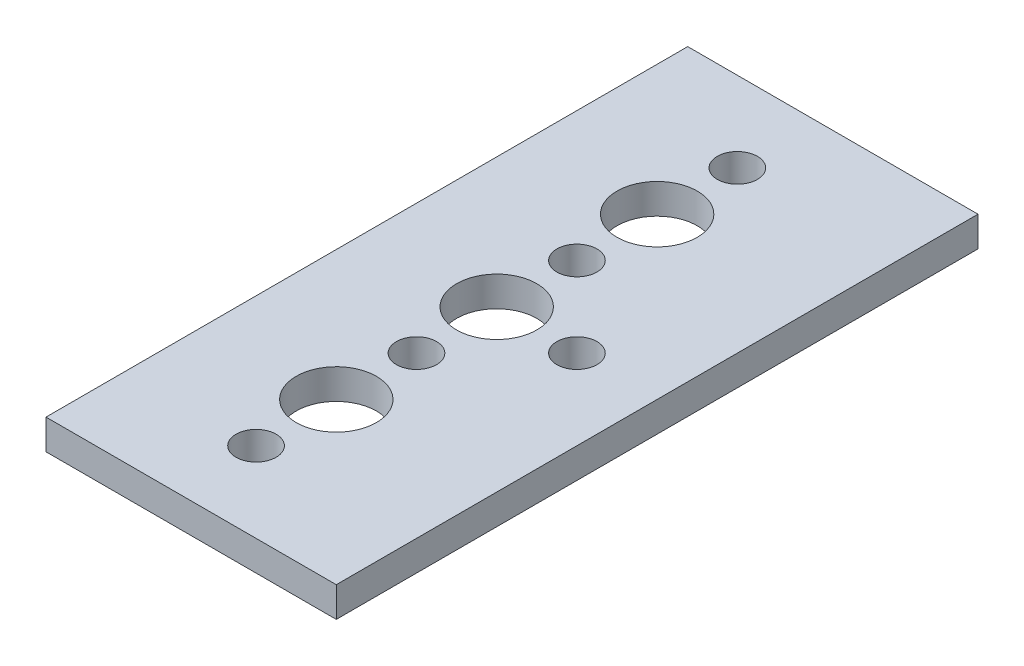
ISO-10303-21;
HEADER;
FILE_DESCRIPTION(('STEP AP214'),'2;1');
FILE_NAME('part.step','',(''),(''),'','','');
FILE_SCHEMA(('AUTOMOTIVE_DESIGN { 1 0 10303 214 1 1 1 1 }'));
ENDSEC;
DATA;
#1=APPLICATION_CONTEXT('core data for automotive mechanical design processes');
#2=APPLICATION_PROTOCOL_DEFINITION('international standard','automotive_design',2000,#1);
#3=PRODUCT_CONTEXT('',#1,'mechanical');
#4=PRODUCT('Part','Part','',(#3));
#5=PRODUCT_RELATED_PRODUCT_CATEGORY('part','',(#4));
#6=PRODUCT_DEFINITION_FORMATION('','',#4);
#7=PRODUCT_DEFINITION_CONTEXT('part definition',#1,'design');
#8=PRODUCT_DEFINITION('design','',#6,#7);
#9=PRODUCT_DEFINITION_SHAPE('','',#8);
#10=(LENGTH_UNIT() NAMED_UNIT(*) SI_UNIT(.MILLI.,.METRE.));
#11=(NAMED_UNIT(*) PLANE_ANGLE_UNIT() SI_UNIT($,.RADIAN.));
#12=(NAMED_UNIT(*) SI_UNIT($,.STERADIAN.) SOLID_ANGLE_UNIT());
#13=UNCERTAINTY_MEASURE_WITH_UNIT(LENGTH_MEASURE(1.E-05),#10,'distance_accuracy_value','');
#14=(GEOMETRIC_REPRESENTATION_CONTEXT(3) GLOBAL_UNCERTAINTY_ASSIGNED_CONTEXT((#13)) GLOBAL_UNIT_ASSIGNED_CONTEXT((#10,
#11,#12)) REPRESENTATION_CONTEXT('',''));
#15=CARTESIAN_POINT('',(0.,0.,0.));
#16=DIRECTION('',(0.,0.,1.));
#17=DIRECTION('',(1.,0.,0.));
#18=AXIS2_PLACEMENT_3D('',#15,#16,#17);
#19=CARTESIAN_POINT('',(0.,3.,0.));
#20=DIRECTION('',(0.,1.,0.));
#21=DIRECTION('',(0.,0.,1.));
#22=AXIS2_PLACEMENT_3D('',#19,#20,#21);
#23=PLANE('',#22);
#24=CARTESIAN_POINT('',(0.,3.,24.));
#25=DIRECTION('',(0.,1.,0.));
#26=DIRECTION('',(0.,0.,-1.));
#27=AXIS2_PLACEMENT_3D('',#24,#25,#26);
#28=CIRCLE('',#27,2.);
#29=CARTESIAN_POINT('',(0.,3.,22.));
#30=VERTEX_POINT('',#29);
#31=EDGE_CURVE('E149',#30,#30,#28,.T.);
#32=ORIENTED_EDGE('',*,*,#31,.F.);
#33=EDGE_LOOP('',(#32));
#34=FACE_BOUND('',#33,.T.);
#35=CARTESIAN_POINT('',(0.,3.,-16.));
#36=DIRECTION('',(0.,1.,0.));
#37=DIRECTION('',(0.,0.,1.));
#38=AXIS2_PLACEMENT_3D('',#35,#36,#37);
#39=CIRCLE('',#38,4.);
#40=CARTESIAN_POINT('',(0.,3.,-12.));
#41=VERTEX_POINT('',#40);
#42=EDGE_CURVE('E137',#41,#41,#39,.T.);
#43=ORIENTED_EDGE('',*,*,#42,.F.);
#44=EDGE_LOOP('',(#43));
#45=FACE_BOUND('',#44,.T.);
#46=CARTESIAN_POINT('',(8.,3.,0.));
#47=DIRECTION('',(0.,1.,0.));
#48=DIRECTION('',(0.,0.,1.));
#49=AXIS2_PLACEMENT_3D('',#46,#47,#48);
#50=CIRCLE('',#49,2.);
#51=CARTESIAN_POINT('',(8.,3.,2.));
#52=VERTEX_POINT('',#51);
#53=EDGE_CURVE('E125',#52,#52,#50,.T.);
#54=ORIENTED_EDGE('',*,*,#53,.F.);
#55=EDGE_LOOP('',(#54));
#56=FACE_BOUND('',#55,.T.);
#57=CARTESIAN_POINT('',(0.,3.,0.));
#58=DIRECTION('',(0.,1.,0.));
#59=DIRECTION('',(0.,0.,1.));
#60=AXIS2_PLACEMENT_3D('',#57,#58,#59);
#61=CIRCLE('',#60,4.);
#62=CARTESIAN_POINT('',(0.,3.,4.));
#63=VERTEX_POINT('',#62);
#64=EDGE_CURVE('E104',#63,#63,#61,.T.);
#65=ORIENTED_EDGE('',*,*,#64,.F.);
#66=EDGE_LOOP('',(#65));
#67=FACE_BOUND('',#66,.T.);
#68=DIRECTION('',(0.,0.,1.));
#69=VECTOR('',#68,1.);
#70=CARTESIAN_POINT('',(-12.95,3.,-32.));
#71=LINE('',#70,#69);
#72=CARTESIAN_POINT('',(-12.95,3.,-32.));
#73=VERTEX_POINT('',#72);
#74=CARTESIAN_POINT('',(-12.95,3.,32.));
#75=VERTEX_POINT('',#74);
#76=EDGE_CURVE('E89',#73,#75,#71,.T.);
#77=ORIENTED_EDGE('',*,*,#76,.T.);
#78=DIRECTION('',(1.,0.,0.));
#79=VECTOR('',#78,1.);
#80=CARTESIAN_POINT('',(-12.95,3.,32.));
#81=LINE('',#80,#79);
#82=CARTESIAN_POINT('',(16.,3.,32.));
#83=VERTEX_POINT('',#82);
#84=EDGE_CURVE('E84',#75,#83,#81,.T.);
#85=ORIENTED_EDGE('',*,*,#84,.T.);
#86=DIRECTION('',(0.,0.,-1.));
#87=VECTOR('',#86,1.);
#88=CARTESIAN_POINT('',(16.,3.,-32.));
#89=LINE('',#88,#87);
#90=CARTESIAN_POINT('',(16.,3.,-32.));
#91=VERTEX_POINT('',#90);
#92=EDGE_CURVE('E87',#83,#91,#89,.T.);
#93=ORIENTED_EDGE('',*,*,#92,.T.);
#94=DIRECTION('',(-1.,0.,0.));
#95=VECTOR('',#94,1.);
#96=CARTESIAN_POINT('',(-12.95,3.,-32.));
#97=LINE('',#96,#95);
#98=EDGE_CURVE('E54',#91,#73,#97,.T.);
#99=ORIENTED_EDGE('',*,*,#98,.T.);
#100=EDGE_LOOP('',(#77,#85,#93,#99));
#101=FACE_BOUND('',#100,.T.);
#102=CARTESIAN_POINT('',(0.,3.,-8.));
#103=DIRECTION('',(0.,1.,0.));
#104=DIRECTION('',(0.,0.,1.));
#105=AXIS2_PLACEMENT_3D('',#102,#103,#104);
#106=CIRCLE('',#105,2.);
#107=CARTESIAN_POINT('',(0.,3.,-6.));
#108=VERTEX_POINT('',#107);
#109=EDGE_CURVE('E119',#108,#108,#106,.T.);
#110=ORIENTED_EDGE('',*,*,#109,.F.);
#111=EDGE_LOOP('',(#110));
#112=FACE_BOUND('',#111,.T.);
#113=CARTESIAN_POINT('',(0.,3.,8.));
#114=DIRECTION('',(0.,1.,0.));
#115=DIRECTION('',(0.,0.,1.));
#116=AXIS2_PLACEMENT_3D('',#113,#114,#115);
#117=CIRCLE('',#116,2.);
#118=CARTESIAN_POINT('',(0.,3.,10.));
#119=VERTEX_POINT('',#118);
#120=EDGE_CURVE('E131',#119,#119,#117,.T.);
#121=ORIENTED_EDGE('',*,*,#120,.F.);
#122=EDGE_LOOP('',(#121));
#123=FACE_BOUND('',#122,.T.);
#124=CARTESIAN_POINT('',(0.,3.,-24.));
#125=DIRECTION('',(0.,1.,0.));
#126=DIRECTION('',(0.,0.,1.));
#127=AXIS2_PLACEMENT_3D('',#124,#125,#126);
#128=CIRCLE('',#127,2.);
#129=CARTESIAN_POINT('',(0.,3.,-22.));
#130=VERTEX_POINT('',#129);
#131=EDGE_CURVE('E143',#130,#130,#128,.T.);
#132=ORIENTED_EDGE('',*,*,#131,.F.);
#133=EDGE_LOOP('',(#132));
#134=FACE_BOUND('',#133,.T.);
#135=CARTESIAN_POINT('',(0.,3.,16.));
#136=DIRECTION('',(0.,1.,0.));
#137=DIRECTION('',(0.,0.,-1.));
#138=AXIS2_PLACEMENT_3D('',#135,#136,#137);
#139=CIRCLE('',#138,4.);
#140=CARTESIAN_POINT('',(0.,3.,12.));
#141=VERTEX_POINT('',#140);
#142=EDGE_CURVE('E155',#141,#141,#139,.T.);
#143=ORIENTED_EDGE('',*,*,#142,.F.);
#144=EDGE_LOOP('',(#143));
#145=FACE_BOUND('',#144,.T.);
#146=ADVANCED_FACE('F37',(#34,#45,#56,#67,#101,#112,#123,#134,#145),#23,.T.);
#147=CARTESIAN_POINT('',(0.,0.,0.));
#148=DIRECTION('',(0.,1.,0.));
#149=DIRECTION('',(0.,0.,1.));
#150=AXIS2_PLACEMENT_3D('',#147,#148,#149);
#151=PLANE('',#150);
#152=DIRECTION('',(0.,0.,1.));
#153=VECTOR('',#152,1.);
#154=CARTESIAN_POINT('',(-12.95,0.,-32.));
#155=LINE('',#154,#153);
#156=CARTESIAN_POINT('',(-12.95,0.,-32.));
#157=VERTEX_POINT('',#156);
#158=CARTESIAN_POINT('',(-12.95,0.,32.));
#159=VERTEX_POINT('',#158);
#160=EDGE_CURVE('E101',#157,#159,#155,.T.);
#161=ORIENTED_EDGE('',*,*,#160,.F.);
#162=DIRECTION('',(-1.,0.,0.));
#163=VECTOR('',#162,1.);
#164=CARTESIAN_POINT('',(-12.95,0.,-32.));
#165=LINE('',#164,#163);
#166=CARTESIAN_POINT('',(16.,0.,-32.));
#167=VERTEX_POINT('',#166);
#168=EDGE_CURVE('E77',#167,#157,#165,.T.);
#169=ORIENTED_EDGE('',*,*,#168,.F.);
#170=DIRECTION('',(0.,0.,-1.));
#171=VECTOR('',#170,1.);
#172=CARTESIAN_POINT('',(16.,0.,-32.));
#173=LINE('',#172,#171);
#174=CARTESIAN_POINT('',(16.,0.,32.));
#175=VERTEX_POINT('',#174);
#176=EDGE_CURVE('E71',#175,#167,#173,.T.);
#177=ORIENTED_EDGE('',*,*,#176,.F.);
#178=DIRECTION('',(1.,0.,0.));
#179=VECTOR('',#178,1.);
#180=CARTESIAN_POINT('',(-12.95,0.,32.));
#181=LINE('',#180,#179);
#182=EDGE_CURVE('E93',#159,#175,#181,.T.);
#183=ORIENTED_EDGE('',*,*,#182,.F.);
#184=EDGE_LOOP('',(#161,#169,#177,#183));
#185=FACE_BOUND('',#184,.T.);
#186=CARTESIAN_POINT('',(0.,0.,0.));
#187=DIRECTION('',(0.,1.,0.));
#188=DIRECTION('',(0.,0.,1.));
#189=AXIS2_PLACEMENT_3D('',#186,#187,#188);
#190=CIRCLE('',#189,4.);
#191=CARTESIAN_POINT('',(0.,0.,4.));
#192=VERTEX_POINT('',#191);
#193=EDGE_CURVE('E116',#192,#192,#190,.T.);
#194=ORIENTED_EDGE('',*,*,#193,.T.);
#195=EDGE_LOOP('',(#194));
#196=FACE_BOUND('',#195,.T.);
#197=CARTESIAN_POINT('',(0.,0.,-8.));
#198=DIRECTION('',(0.,1.,0.));
#199=DIRECTION('',(0.,0.,1.));
#200=AXIS2_PLACEMENT_3D('',#197,#198,#199);
#201=CIRCLE('',#200,2.);
#202=CARTESIAN_POINT('',(0.,0.,-6.));
#203=VERTEX_POINT('',#202);
#204=EDGE_CURVE('E122',#203,#203,#201,.T.);
#205=ORIENTED_EDGE('',*,*,#204,.T.);
#206=EDGE_LOOP('',(#205));
#207=FACE_BOUND('',#206,.T.);
#208=CARTESIAN_POINT('',(8.,0.,0.));
#209=DIRECTION('',(0.,1.,0.));
#210=DIRECTION('',(0.,0.,1.));
#211=AXIS2_PLACEMENT_3D('',#208,#209,#210);
#212=CIRCLE('',#211,2.);
#213=CARTESIAN_POINT('',(8.,0.,2.));
#214=VERTEX_POINT('',#213);
#215=EDGE_CURVE('E128',#214,#214,#212,.T.);
#216=ORIENTED_EDGE('',*,*,#215,.T.);
#217=EDGE_LOOP('',(#216));
#218=FACE_BOUND('',#217,.T.);
#219=CARTESIAN_POINT('',(0.,0.,8.));
#220=DIRECTION('',(0.,1.,0.));
#221=DIRECTION('',(0.,0.,1.));
#222=AXIS2_PLACEMENT_3D('',#219,#220,#221);
#223=CIRCLE('',#222,2.);
#224=CARTESIAN_POINT('',(0.,0.,10.));
#225=VERTEX_POINT('',#224);
#226=EDGE_CURVE('E134',#225,#225,#223,.T.);
#227=ORIENTED_EDGE('',*,*,#226,.T.);
#228=EDGE_LOOP('',(#227));
#229=FACE_BOUND('',#228,.T.);
#230=CARTESIAN_POINT('',(0.,0.,-16.));
#231=DIRECTION('',(0.,1.,0.));
#232=DIRECTION('',(0.,0.,1.));
#233=AXIS2_PLACEMENT_3D('',#230,#231,#232);
#234=CIRCLE('',#233,4.);
#235=CARTESIAN_POINT('',(0.,0.,-12.));
#236=VERTEX_POINT('',#235);
#237=EDGE_CURVE('E140',#236,#236,#234,.T.);
#238=ORIENTED_EDGE('',*,*,#237,.T.);
#239=EDGE_LOOP('',(#238));
#240=FACE_BOUND('',#239,.T.);
#241=CARTESIAN_POINT('',(0.,0.,-24.));
#242=DIRECTION('',(0.,1.,0.));
#243=DIRECTION('',(0.,0.,1.));
#244=AXIS2_PLACEMENT_3D('',#241,#242,#243);
#245=CIRCLE('',#244,2.);
#246=CARTESIAN_POINT('',(0.,0.,-22.));
#247=VERTEX_POINT('',#246);
#248=EDGE_CURVE('E146',#247,#247,#245,.T.);
#249=ORIENTED_EDGE('',*,*,#248,.T.);
#250=EDGE_LOOP('',(#249));
#251=FACE_BOUND('',#250,.T.);
#252=CARTESIAN_POINT('',(0.,0.,24.));
#253=DIRECTION('',(0.,1.,0.));
#254=DIRECTION('',(0.,0.,-1.));
#255=AXIS2_PLACEMENT_3D('',#252,#253,#254);
#256=CIRCLE('',#255,2.);
#257=CARTESIAN_POINT('',(0.,0.,22.));
#258=VERTEX_POINT('',#257);
#259=EDGE_CURVE('E152',#258,#258,#256,.T.);
#260=ORIENTED_EDGE('',*,*,#259,.T.);
#261=EDGE_LOOP('',(#260));
#262=FACE_BOUND('',#261,.T.);
#263=CARTESIAN_POINT('',(0.,0.,16.));
#264=DIRECTION('',(0.,1.,0.));
#265=DIRECTION('',(0.,0.,-1.));
#266=AXIS2_PLACEMENT_3D('',#263,#264,#265);
#267=CIRCLE('',#266,4.);
#268=CARTESIAN_POINT('',(0.,0.,12.));
#269=VERTEX_POINT('',#268);
#270=EDGE_CURVE('E158',#269,#269,#267,.T.);
#271=ORIENTED_EDGE('',*,*,#270,.T.);
#272=EDGE_LOOP('',(#271));
#273=FACE_BOUND('',#272,.T.);
#274=ADVANCED_FACE('F112',(#185,#196,#207,#218,#229,#240,#251,#262,#273),#151,.F.);
#275=CARTESIAN_POINT('',(-12.95,3.,-32.));
#276=DIRECTION('',(1.,0.,0.));
#277=DIRECTION('',(0.,0.,-1.));
#278=AXIS2_PLACEMENT_3D('',#275,#276,#277);
#279=PLANE('',#278);
#280=ORIENTED_EDGE('',*,*,#160,.T.);
#281=DIRECTION('',(0.,-1.,0.));
#282=VECTOR('',#281,1.);
#283=CARTESIAN_POINT('',(-12.95,3.,32.));
#284=LINE('',#283,#282);
#285=EDGE_CURVE('E11',#75,#159,#284,.T.);
#286=ORIENTED_EDGE('',*,*,#285,.F.);
#287=ORIENTED_EDGE('',*,*,#76,.F.);
#288=DIRECTION('',(0.,-1.,0.));
#289=VECTOR('',#288,1.);
#290=CARTESIAN_POINT('',(-12.95,3.,-32.));
#291=LINE('',#290,#289);
#292=EDGE_CURVE('E97',#73,#157,#291,.T.);
#293=ORIENTED_EDGE('',*,*,#292,.T.);
#294=EDGE_LOOP('',(#280,#286,#287,#293));
#295=FACE_BOUND('',#294,.T.);
#296=ADVANCED_FACE('F39',(#295),#279,.F.);
#297=CARTESIAN_POINT('',(-12.95,3.,32.));
#298=DIRECTION('',(0.,0.,-1.));
#299=DIRECTION('',(-1.,0.,0.));
#300=AXIS2_PLACEMENT_3D('',#297,#298,#299);
#301=PLANE('',#300);
#302=ORIENTED_EDGE('',*,*,#182,.T.);
#303=DIRECTION('',(0.,-1.,0.));
#304=VECTOR('',#303,1.);
#305=CARTESIAN_POINT('',(16.,3.,32.));
#306=LINE('',#305,#304);
#307=EDGE_CURVE('E46',#83,#175,#306,.T.);
#308=ORIENTED_EDGE('',*,*,#307,.F.);
#309=ORIENTED_EDGE('',*,*,#84,.F.);
#310=ORIENTED_EDGE('',*,*,#285,.T.);
#311=EDGE_LOOP('',(#302,#308,#309,#310));
#312=FACE_BOUND('',#311,.T.);
#313=ADVANCED_FACE('F92',(#312),#301,.F.);
#314=CARTESIAN_POINT('',(16.,3.,-32.));
#315=DIRECTION('',(-1.,0.,0.));
#316=DIRECTION('',(0.,0.,1.));
#317=AXIS2_PLACEMENT_3D('',#314,#315,#316);
#318=PLANE('',#317);
#319=ORIENTED_EDGE('',*,*,#176,.T.);
#320=DIRECTION('',(0.,-1.,0.));
#321=VECTOR('',#320,1.);
#322=CARTESIAN_POINT('',(16.,3.,-32.));
#323=LINE('',#322,#321);
#324=EDGE_CURVE('E94',#91,#167,#323,.T.);
#325=ORIENTED_EDGE('',*,*,#324,.F.);
#326=ORIENTED_EDGE('',*,*,#92,.F.);
#327=ORIENTED_EDGE('',*,*,#307,.T.);
#328=EDGE_LOOP('',(#319,#325,#326,#327));
#329=FACE_BOUND('',#328,.T.);
#330=ADVANCED_FACE('F95',(#329),#318,.F.);
#331=CARTESIAN_POINT('',(-12.95,3.,-32.));
#332=DIRECTION('',(0.,0.,1.));
#333=DIRECTION('',(1.,0.,0.));
#334=AXIS2_PLACEMENT_3D('',#331,#332,#333);
#335=PLANE('',#334);
#336=ORIENTED_EDGE('',*,*,#168,.T.);
#337=ORIENTED_EDGE('',*,*,#292,.F.);
#338=ORIENTED_EDGE('',*,*,#98,.F.);
#339=ORIENTED_EDGE('',*,*,#324,.T.);
#340=EDGE_LOOP('',(#336,#337,#338,#339));
#341=FACE_BOUND('',#340,.T.);
#342=ADVANCED_FACE('F109',(#341),#335,.F.);
#343=CARTESIAN_POINT('',(0.,3.,0.));
#344=DIRECTION('',(0.,-1.,0.));
#345=DIRECTION('',(0.,0.,-1.));
#346=AXIS2_PLACEMENT_3D('',#343,#344,#345);
#347=CYLINDRICAL_SURFACE('',#346,4.);
#348=ORIENTED_EDGE('',*,*,#64,.T.);
#349=EDGE_LOOP('',(#348));
#350=FACE_BOUND('',#349,.T.);
#351=ORIENTED_EDGE('',*,*,#193,.F.);
#352=EDGE_LOOP('',(#351));
#353=FACE_BOUND('',#352,.T.);
#354=ADVANCED_FACE('F177',(#350,#353),#347,.F.);
#355=CARTESIAN_POINT('',(0.,3.,-8.));
#356=DIRECTION('',(0.,-1.,0.));
#357=DIRECTION('',(0.,0.,-1.));
#358=AXIS2_PLACEMENT_3D('',#355,#356,#357);
#359=CYLINDRICAL_SURFACE('',#358,2.);
#360=ORIENTED_EDGE('',*,*,#109,.T.);
#361=EDGE_LOOP('',(#360));
#362=FACE_BOUND('',#361,.T.);
#363=ORIENTED_EDGE('',*,*,#204,.F.);
#364=EDGE_LOOP('',(#363));
#365=FACE_BOUND('',#364,.T.);
#366=ADVANCED_FACE('F223',(#362,#365),#359,.F.);
#367=CARTESIAN_POINT('',(8.,3.,0.));
#368=DIRECTION('',(0.,-1.,0.));
#369=DIRECTION('',(0.,0.,-1.));
#370=AXIS2_PLACEMENT_3D('',#367,#368,#369);
#371=CYLINDRICAL_SURFACE('',#370,2.);
#372=ORIENTED_EDGE('',*,*,#53,.T.);
#373=EDGE_LOOP('',(#372));
#374=FACE_BOUND('',#373,.T.);
#375=ORIENTED_EDGE('',*,*,#215,.F.);
#376=EDGE_LOOP('',(#375));
#377=FACE_BOUND('',#376,.T.);
#378=ADVANCED_FACE('F231',(#374,#377),#371,.F.);
#379=CARTESIAN_POINT('',(0.,3.,8.));
#380=DIRECTION('',(0.,-1.,0.));
#381=DIRECTION('',(0.,0.,-1.));
#382=AXIS2_PLACEMENT_3D('',#379,#380,#381);
#383=CYLINDRICAL_SURFACE('',#382,2.);
#384=ORIENTED_EDGE('',*,*,#120,.T.);
#385=EDGE_LOOP('',(#384));
#386=FACE_BOUND('',#385,.T.);
#387=ORIENTED_EDGE('',*,*,#226,.F.);
#388=EDGE_LOOP('',(#387));
#389=FACE_BOUND('',#388,.T.);
#390=ADVANCED_FACE('F239',(#386,#389),#383,.F.);
#391=CARTESIAN_POINT('',(0.,3.,-16.));
#392=DIRECTION('',(0.,-1.,0.));
#393=DIRECTION('',(0.,0.,-1.));
#394=AXIS2_PLACEMENT_3D('',#391,#392,#393);
#395=CYLINDRICAL_SURFACE('',#394,4.);
#396=ORIENTED_EDGE('',*,*,#42,.T.);
#397=EDGE_LOOP('',(#396));
#398=FACE_BOUND('',#397,.T.);
#399=ORIENTED_EDGE('',*,*,#237,.F.);
#400=EDGE_LOOP('',(#399));
#401=FACE_BOUND('',#400,.T.);
#402=ADVANCED_FACE('F248',(#398,#401),#395,.F.);
#403=CARTESIAN_POINT('',(0.,3.,-24.));
#404=DIRECTION('',(0.,-1.,0.));
#405=DIRECTION('',(0.,0.,-1.));
#406=AXIS2_PLACEMENT_3D('',#403,#404,#405);
#407=CYLINDRICAL_SURFACE('',#406,2.);
#408=ORIENTED_EDGE('',*,*,#131,.T.);
#409=EDGE_LOOP('',(#408));
#410=FACE_BOUND('',#409,.T.);
#411=ORIENTED_EDGE('',*,*,#248,.F.);
#412=EDGE_LOOP('',(#411));
#413=FACE_BOUND('',#412,.T.);
#414=ADVANCED_FACE('F257',(#410,#413),#407,.F.);
#415=CARTESIAN_POINT('',(0.,3.,24.));
#416=DIRECTION('',(0.,-1.,0.));
#417=DIRECTION('',(0.,0.,-1.));
#418=AXIS2_PLACEMENT_3D('',#415,#416,#417);
#419=CYLINDRICAL_SURFACE('',#418,2.);
#420=ORIENTED_EDGE('',*,*,#31,.T.);
#421=EDGE_LOOP('',(#420));
#422=FACE_BOUND('',#421,.T.);
#423=ORIENTED_EDGE('',*,*,#259,.F.);
#424=EDGE_LOOP('',(#423));
#425=FACE_BOUND('',#424,.T.);
#426=ADVANCED_FACE('F266',(#422,#425),#419,.F.);
#427=CARTESIAN_POINT('',(0.,3.,16.));
#428=DIRECTION('',(0.,-1.,0.));
#429=DIRECTION('',(0.,0.,-1.));
#430=AXIS2_PLACEMENT_3D('',#427,#428,#429);
#431=CYLINDRICAL_SURFACE('',#430,4.);
#432=ORIENTED_EDGE('',*,*,#142,.T.);
#433=EDGE_LOOP('',(#432));
#434=FACE_BOUND('',#433,.T.);
#435=ORIENTED_EDGE('',*,*,#270,.F.);
#436=EDGE_LOOP('',(#435));
#437=FACE_BOUND('',#436,.T.);
#438=ADVANCED_FACE('F164',(#434,#437),#431,.F.);
#439=CLOSED_SHELL('',(#146,#274,#296,#313,#330,#342,#354,#366,#378,#390,#402,#414,#426,#438));
#440=MANIFOLD_SOLID_BREP('B2',#439);
#441=ADVANCED_BREP_SHAPE_REPRESENTATION('',(#18,#440),#14);
#442=SHAPE_DEFINITION_REPRESENTATION(#9,#441);
ENDSEC;
END-ISO-10303-21;
